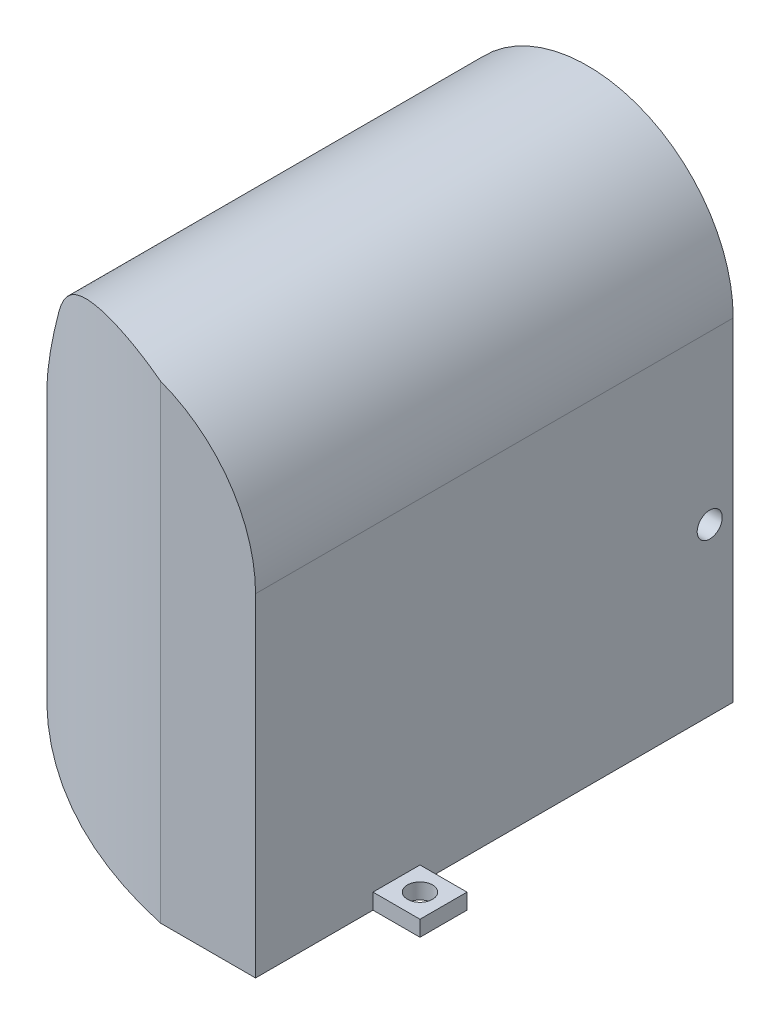
ISO-10303-21;
HEADER;
FILE_DESCRIPTION(('STEP AP214'),'2;1');
FILE_NAME('part.step','',(''),(''),'','','');
FILE_SCHEMA(('AUTOMOTIVE_DESIGN { 1 0 10303 214 1 1 1 1 }'));
ENDSEC;
DATA;
#1=APPLICATION_CONTEXT('core data for automotive mechanical design processes');
#2=APPLICATION_PROTOCOL_DEFINITION('international standard','automotive_design',2000,#1);
#3=PRODUCT_CONTEXT('',#1,'mechanical');
#4=PRODUCT('Part','Part','',(#3));
#5=PRODUCT_RELATED_PRODUCT_CATEGORY('part','',(#4));
#6=PRODUCT_DEFINITION_FORMATION('','',#4);
#7=PRODUCT_DEFINITION_CONTEXT('part definition',#1,'design');
#8=PRODUCT_DEFINITION('design','',#6,#7);
#9=PRODUCT_DEFINITION_SHAPE('','',#8);
#10=(LENGTH_UNIT() NAMED_UNIT(*) SI_UNIT(.MILLI.,.METRE.));
#11=(NAMED_UNIT(*) PLANE_ANGLE_UNIT() SI_UNIT($,.RADIAN.));
#12=(NAMED_UNIT(*) SI_UNIT($,.STERADIAN.) SOLID_ANGLE_UNIT());
#13=UNCERTAINTY_MEASURE_WITH_UNIT(LENGTH_MEASURE(1.E-05),#10,'distance_accuracy_value','');
#14=(GEOMETRIC_REPRESENTATION_CONTEXT(3) GLOBAL_UNCERTAINTY_ASSIGNED_CONTEXT((#13)) GLOBAL_UNIT_ASSIGNED_CONTEXT((#10,
#11,#12)) REPRESENTATION_CONTEXT('',''));
#15=CARTESIAN_POINT('',(0.,0.,0.));
#16=DIRECTION('',(0.,0.,1.));
#17=DIRECTION('',(1.,0.,0.));
#18=AXIS2_PLACEMENT_3D('',#15,#16,#17);
#19=CARTESIAN_POINT('',(41.,0.,60.));
#20=DIRECTION('',(-1.,0.,0.));
#21=DIRECTION('',(0.,0.,1.));
#22=AXIS2_PLACEMENT_3D('',#19,#20,#21);
#23=PLANE('',#22);
#24=DIRECTION('',(0.,0.,-1.));
#25=VECTOR('',#24,1.);
#26=CARTESIAN_POINT('',(41.,0.,60.));
#27=LINE('',#26,#25);
#28=CARTESIAN_POINT('',(41.,0.,61.));
#29=VERTEX_POINT('',#28);
#30=CARTESIAN_POINT('',(41.,0.,46.));
#31=VERTEX_POINT('',#30);
#32=EDGE_CURVE('E453',#29,#31,#27,.T.);
#33=ORIENTED_EDGE('',*,*,#32,.T.);
#34=DIRECTION('',(0.,1.,0.));
#35=VECTOR('',#34,1.);
#36=CARTESIAN_POINT('',(41.,0.,46.));
#37=LINE('',#36,#35);
#38=CARTESIAN_POINT('',(41.,2.00000000000001,46.));
#39=VERTEX_POINT('',#38);
#40=EDGE_CURVE('E64',#31,#39,#37,.T.);
#41=ORIENTED_EDGE('',*,*,#40,.T.);
#42=DIRECTION('',(0.,0.,-1.));
#43=VECTOR('',#42,1.);
#44=CARTESIAN_POINT('',(41.,2.00000000000001,60.));
#45=LINE('',#44,#43);
#46=CARTESIAN_POINT('',(41.,2.00000000000001,40.));
#47=VERTEX_POINT('',#46);
#48=EDGE_CURVE('E59',#39,#47,#45,.T.);
#49=ORIENTED_EDGE('',*,*,#48,.T.);
#50=DIRECTION('',(0.,-1.,0.));
#51=VECTOR('',#50,1.);
#52=CARTESIAN_POINT('',(41.,0.,40.));
#53=LINE('',#52,#51);
#54=CARTESIAN_POINT('',(41.,0.,40.));
#55=VERTEX_POINT('',#54);
#56=EDGE_CURVE('E221',#47,#55,#53,.T.);
#57=ORIENTED_EDGE('',*,*,#56,.T.);
#58=CARTESIAN_POINT('',(41.,0.,0.));
#59=VERTEX_POINT('',#58);
#60=EDGE_CURVE('E461',#55,#59,#27,.T.);
#61=ORIENTED_EDGE('',*,*,#60,.T.);
#62=DIRECTION('',(0.,1.,0.));
#63=VECTOR('',#62,1.);
#64=CARTESIAN_POINT('',(41.,0.,0.));
#65=LINE('',#64,#63);
#66=CARTESIAN_POINT('',(41.,42.5,0.));
#67=VERTEX_POINT('',#66);
#68=EDGE_CURVE('E446',#59,#67,#65,.T.);
#69=ORIENTED_EDGE('',*,*,#68,.T.);
#70=DIRECTION('',(0.,0.,-1.));
#71=VECTOR('',#70,1.);
#72=CARTESIAN_POINT('',(41.,42.5,60.));
#73=LINE('',#72,#71);
#74=CARTESIAN_POINT('',(41.,42.5,61.));
#75=VERTEX_POINT('',#74);
#76=EDGE_CURVE('E468',#75,#67,#73,.T.);
#77=ORIENTED_EDGE('',*,*,#76,.F.);
#78=DIRECTION('',(0.,1.,0.));
#79=VECTOR('',#78,1.);
#80=CARTESIAN_POINT('',(41.,0.,61.));
#81=LINE('',#80,#79);
#82=EDGE_CURVE('E472',#29,#75,#81,.T.);
#83=ORIENTED_EDGE('',*,*,#82,.F.);
#84=EDGE_LOOP('',(#33,#41,#49,#57,#61,#69,#77,#83));
#85=FACE_BOUND('',#84,.T.);
#86=CARTESIAN_POINT('',(41.,21.1481907925071,3.));
#87=DIRECTION('',(-1.,0.,0.));
#88=DIRECTION('',(0.,0.,1.));
#89=AXIS2_PLACEMENT_3D('',#86,#87,#88);
#90=CIRCLE('',#89,1.6);
#91=CARTESIAN_POINT('',(41.,21.1481907925071,4.6));
#92=VERTEX_POINT('',#91);
#93=EDGE_CURVE('E258',#92,#92,#90,.T.);
#94=ORIENTED_EDGE('',*,*,#93,.T.);
#95=EDGE_LOOP('',(#94));
#96=FACE_BOUND('',#95,.T.);
#97=ADVANCED_FACE('F43',(#85,#96),#23,.F.);
#98=CARTESIAN_POINT('',(22.4,42.5,60.));
#99=DIRECTION('',(0.,0.,-1.));
#100=DIRECTION('',(-1.,0.,0.));
#101=AXIS2_PLACEMENT_3D('',#98,#99,#100);
#102=CYLINDRICAL_SURFACE('',#101,18.6);
#103=DIRECTION('',(0.,0.,1.));
#104=VECTOR('',#103,1.);
#105=CARTESIAN_POINT('',(5.95963161562967,51.1990969293483,60.));
#106=LINE('',#105,#104);
#107=CARTESIAN_POINT('',(5.95963161562967,51.1990969293483,51.0792206622552));
#108=VERTEX_POINT('',#107);
#109=CARTESIAN_POINT('',(5.95963161562967,51.1990969293483,0.));
#110=VERTEX_POINT('',#109);
#111=EDGE_CURVE('E452',#108,#110,#106,.F.);
#112=ORIENTED_EDGE('',*,*,#111,.F.);
#113=CARTESIAN_POINT('',(5.95963161562967,51.1990969293483,51.0792206622552));
#114=CARTESIAN_POINT('',(6.22181353208901,51.6945736764828,51.2593201252422));
#115=CARTESIAN_POINT('',(6.50454638650126,52.1747527024764,51.4506623513701));
#116=CARTESIAN_POINT('',(7.10767465086969,53.102388209684,51.8510981432475));
#117=CARTESIAN_POINT('',(7.42803835598747,53.5498717292127,52.0601767250356));
#118=CARTESIAN_POINT('',(8.10265309408327,54.409822920193,52.4911659809748));
#119=CARTESIAN_POINT('',(8.45682359672568,54.8223695943685,52.713045686201));
#120=CARTESIAN_POINT('',(9.19704802370154,55.612404122338,53.1661165525255));
#121=CARTESIAN_POINT('',(9.58310930009141,55.9898838489908,53.3973098544389));
#122=CARTESIAN_POINT('',(10.3832507519513,56.7072338719968,53.864528237691));
#123=CARTESIAN_POINT('',(10.7972342641252,57.0472241649493,54.1005348571444));
#124=CARTESIAN_POINT('',(11.6520905358339,57.6897447139373,54.5748359573429));
#125=CARTESIAN_POINT('',(12.0929638225008,57.9922742352603,54.8131304828615));
#126=CARTESIAN_POINT('',(12.9998704425782,58.5587577445324,55.2892484738611));
#127=CARTESIAN_POINT('',(13.4659302496784,58.8226700176514,55.5270711601659));
#128=CARTESIAN_POINT('',(14.4205193451211,59.3099696703105,55.9992085697476));
#129=CARTESIAN_POINT('',(14.9090499801367,59.5333546170777,56.2335230816617));
#130=CARTESIAN_POINT('',(15.9394074829438,59.951362917407,56.7114800568628));
#131=CARTESIAN_POINT('',(16.4826157593686,60.1430739045921,56.9547021977016));
#132=CARTESIAN_POINT('',(17.5885066876812,60.4761791259661,57.4312810605531));
#133=CARTESIAN_POINT('',(18.151190274113,60.6175709418517,57.6646373079433));
#134=CARTESIAN_POINT('',(19.291389178702,60.8475955007484,58.1184808603315));
#135=CARTESIAN_POINT('',(19.868882026865,60.9363037502546,58.3389861723232));
#136=CARTESIAN_POINT('',(21.0350764992719,61.0591130043127,58.7651040262385));
#137=CARTESIAN_POINT('',(21.6237773083995,61.0932179647384,58.9707176459982));
#138=CARTESIAN_POINT('',(22.7711813970593,61.1045945189213,59.3529719951072));
#139=CARTESIAN_POINT('',(23.3295170676076,61.0852147154793,59.5306156171097));
#140=CARTESIAN_POINT('',(24.4469588294768,60.9955160116376,59.8696512165966));
#141=CARTESIAN_POINT('',(25.0060647923091,60.9252047722397,60.031045634095));
#142=CARTESIAN_POINT('',(26.123082100278,60.7324261704588,60.3374880151854));
#143=CARTESIAN_POINT('',(26.6809722875649,60.6096907647318,60.4824470571938));
#144=CARTESIAN_POINT('',(27.5105534143728,60.3864319736904,60.6865157870998));
#145=CARTESIAN_POINT('',(27.7859885503491,60.3054430808235,60.7523358679176));
#146=CARTESIAN_POINT('',(28.3337565361517,60.1304620321532,60.8795124603225));
#147=CARTESIAN_POINT('',(28.6060892295192,60.0364692236659,60.9408687476298));
#148=CARTESIAN_POINT('',(28.8765566230851,59.9360033926348,61.));
#149=B_SPLINE_CURVE_WITH_KNOTS('',3,(#113,#114,#115,#116,#117,#118,#119,#120,#121,#122,#123,
#124,#125,#126,#127,#128,#129,#130,#131,#132,#133,#134,#135,#136,#137,#138,#139,#140,#141,#142,
#143,#144,#145,#146,#147,#148),.UNSPECIFIED.,.F.,.F.,(4,2,2,2,2,2,2,2,2,2,2,2,2,2,2,2,2,4),(0.,
1.76529700066936,3.52911722516215,5.28883604251708,7.04896168139588,8.80327909443648,
10.5576309091981,12.3138640240531,14.0702025271538,15.9436933987041,17.8172742967289,
19.6881634431577,21.5589170421376,23.3152466385289,25.0713121062801,26.836465840644,
27.7198042976513,28.6031871066947),.UNSPECIFIED.);
#150=CARTESIAN_POINT('',(28.8765566230851,59.9360033926348,61.));
#151=VERTEX_POINT('',#150);
#152=EDGE_CURVE('E465',#108,#151,#149,.T.);
#153=ORIENTED_EDGE('',*,*,#152,.T.);
#154=CARTESIAN_POINT('',(22.4,42.5,61.));
#155=DIRECTION('',(0.,0.,1.));
#156=DIRECTION('',(1.,0.,0.));
#157=AXIS2_PLACEMENT_3D('',#154,#155,#156);
#158=CIRCLE('',#157,18.6);
#159=EDGE_CURVE('E462',#75,#151,#158,.T.);
#160=ORIENTED_EDGE('',*,*,#159,.F.);
#161=ORIENTED_EDGE('',*,*,#76,.T.);
#162=CARTESIAN_POINT('',(22.4,42.5,0.));
#163=DIRECTION('',(0.,0.,1.));
#164=DIRECTION('',(1.,0.,0.));
#165=AXIS2_PLACEMENT_3D('',#162,#163,#164);
#166=CIRCLE('',#165,18.6);
#167=EDGE_CURVE('E442',#67,#110,#166,.T.);
#168=ORIENTED_EDGE('',*,*,#167,.T.);
#169=EDGE_LOOP('',(#112,#153,#160,#161,#168));
#170=FACE_BOUND('',#169,.T.);
#171=ADVANCED_FACE('F337',(#170),#102,.T.);
#172=CARTESIAN_POINT('',(-16.5091487577331,8.73549070841278,60.));
#173=DIRECTION('',(-0.883890773353243,0.467693383298294,0.));
#174=DIRECTION('',(-0.467693383298294,-0.883890773353244,0.));
#175=AXIS2_PLACEMENT_3D('',#172,#173,#174);
#176=PLANE('',#175);
#177=CARTESIAN_POINT('',(-7.47471471767172,25.8096105819147,3.));
#178=DIRECTION('',(-0.883890773353243,0.467693383298294,0.));
#179=DIRECTION('',(-0.467693383298294,-0.883890773353244,0.));
#180=AXIS2_PLACEMENT_3D('',#177,#178,#179);
#181=CIRCLE('',#180,1.6);
#182=CARTESIAN_POINT('',(-8.22302413094899,24.3953853445495,3.));
#183=VERTEX_POINT('',#182);
#184=EDGE_CURVE('E254',#183,#183,#181,.T.);
#185=ORIENTED_EDGE('',*,*,#184,.F.);
#186=EDGE_LOOP('',(#185));
#187=FACE_BOUND('',#186,.T.);
#188=ORIENTED_EDGE('',*,*,#111,.T.);
#189=DIRECTION('',(0.467693383298294,0.883890773353244,0.));
#190=VECTOR('',#189,1.);
#191=CARTESIAN_POINT('',(-16.5091487577331,8.73549070841278,0.));
#192=LINE('',#191,#190);
#193=CARTESIAN_POINT('',(-21.1313615099819,0.,0.));
#194=VERTEX_POINT('',#193);
#195=EDGE_CURVE('E445',#194,#110,#192,.T.);
#196=ORIENTED_EDGE('',*,*,#195,.F.);
#197=DIRECTION('',(0.,0.,-1.));
#198=VECTOR('',#197,1.);
#199=CARTESIAN_POINT('',(-21.1313615099819,0.,60.));
#200=LINE('',#199,#198);
#201=CARTESIAN_POINT('',(-21.1313615099819,0.,9.45382467667989));
#202=VERTEX_POINT('',#201);
#203=EDGE_CURVE('E449',#202,#194,#200,.T.);
#204=ORIENTED_EDGE('',*,*,#203,.F.);
#205=CARTESIAN_POINT('',(42.76,120.747880881674,-2.5));
#206=DIRECTION('',(-0.883890773353243,0.467693383298294,0.));
#207=DIRECTION('',(-0.467693383298294,-0.883890773353244,0.));
#208=AXIS2_PLACEMENT_3D('',#205,#206,#207);
#209=ELLIPSE('',#208,138.979943529676,65.);
#210=EDGE_CURVE('E456',#108,#202,#209,.F.);
#211=ORIENTED_EDGE('',*,*,#210,.F.);
#212=EDGE_LOOP('',(#188,#196,#204,#211));
#213=FACE_BOUND('',#212,.T.);
#214=ADVANCED_FACE('F344',(#187,#213),#176,.T.);
#215=CARTESIAN_POINT('',(0.,0.,60.));
#216=DIRECTION('',(0.,-1.,0.));
#217=DIRECTION('',(1.,0.,0.));
#218=AXIS2_PLACEMENT_3D('',#215,#216,#217);
#219=PLANE('',#218);
#220=ORIENTED_EDGE('',*,*,#60,.F.);
#221=DIRECTION('',(1.,0.,0.));
#222=VECTOR('',#221,1.);
#223=CARTESIAN_POINT('',(40.,0.,40.));
#224=LINE('',#223,#222);
#225=CARTESIAN_POINT('',(47.,0.,40.));
#226=VERTEX_POINT('',#225);
#227=EDGE_CURVE('E243',#55,#226,#224,.T.);
#228=ORIENTED_EDGE('',*,*,#227,.T.);
#229=DIRECTION('',(0.,0.,1.));
#230=VECTOR('',#229,1.);
#231=CARTESIAN_POINT('',(47.,0.,46.));
#232=LINE('',#231,#230);
#233=CARTESIAN_POINT('',(47.,0.,46.));
#234=VERTEX_POINT('',#233);
#235=EDGE_CURVE('E231',#226,#234,#232,.T.);
#236=ORIENTED_EDGE('',*,*,#235,.T.);
#237=DIRECTION('',(-1.,0.,0.));
#238=VECTOR('',#237,1.);
#239=CARTESIAN_POINT('',(40.,0.,46.));
#240=LINE('',#239,#238);
#241=EDGE_CURVE('E240',#234,#31,#240,.T.);
#242=ORIENTED_EDGE('',*,*,#241,.T.);
#243=ORIENTED_EDGE('',*,*,#32,.F.);
#244=DIRECTION('',(-1.,0.,0.));
#245=VECTOR('',#244,1.);
#246=CARTESIAN_POINT('',(0.,0.,61.));
#247=LINE('',#246,#245);
#248=CARTESIAN_POINT('',(28.8765566230851,0.,61.));
#249=VERTEX_POINT('',#248);
#250=EDGE_CURVE('E458',#29,#249,#247,.T.);
#251=ORIENTED_EDGE('',*,*,#250,.T.);
#252=CARTESIAN_POINT('',(42.76,0.,-2.5));
#253=DIRECTION('',(0.,-1.,0.));
#254=DIRECTION('',(1.,0.,0.));
#255=AXIS2_PLACEMENT_3D('',#252,#253,#254);
#256=CIRCLE('',#255,65.);
#257=EDGE_CURVE('E454',#202,#249,#256,.F.);
#258=ORIENTED_EDGE('',*,*,#257,.F.);
#259=ORIENTED_EDGE('',*,*,#203,.T.);
#260=DIRECTION('',(-1.,0.,0.));
#261=VECTOR('',#260,1.);
#262=CARTESIAN_POINT('',(0.,0.,0.));
#263=LINE('',#262,#261);
#264=CARTESIAN_POINT('',(-20.,0.,0.));
#265=VERTEX_POINT('',#264);
#266=EDGE_CURVE('E448',#265,#194,#263,.T.);
#267=ORIENTED_EDGE('',*,*,#266,.F.);
#268=DIRECTION('',(0.,0.,-1.));
#269=VECTOR('',#268,1.);
#270=CARTESIAN_POINT('',(-20.,0.,60.));
#271=LINE('',#270,#269);
#272=CARTESIAN_POINT('',(-20.,0.,10.0372405257298));
#273=VERTEX_POINT('',#272);
#274=EDGE_CURVE('E611',#273,#265,#271,.T.);
#275=ORIENTED_EDGE('',*,*,#274,.F.);
#276=CARTESIAN_POINT('',(42.76,0.,-2.5));
#277=DIRECTION('',(0.,1.,0.));
#278=DIRECTION('',(1.,0.,0.));
#279=AXIS2_PLACEMENT_3D('',#276,#277,#278);
#280=CIRCLE('',#279,64.);
#281=CARTESIAN_POINT('',(28.9850226860441,0.,60.));
#282=VERTEX_POINT('',#281);
#283=EDGE_CURVE('E289',#273,#282,#280,.T.);
#284=ORIENTED_EDGE('',*,*,#283,.T.);
#285=DIRECTION('',(-1.,0.,0.));
#286=VECTOR('',#285,1.);
#287=CARTESIAN_POINT('',(0.,0.,60.));
#288=LINE('',#287,#286);
#289=CARTESIAN_POINT('',(40.,0.,60.));
#290=VERTEX_POINT('',#289);
#291=EDGE_CURVE('E616',#290,#282,#288,.T.);
#292=ORIENTED_EDGE('',*,*,#291,.F.);
#293=DIRECTION('',(0.,0.,-1.));
#294=VECTOR('',#293,1.);
#295=CARTESIAN_POINT('',(40.,0.,60.));
#296=LINE('',#295,#294);
#297=CARTESIAN_POINT('',(40.,0.,0.));
#298=VERTEX_POINT('',#297);
#299=EDGE_CURVE('E498',#290,#298,#296,.T.);
#300=ORIENTED_EDGE('',*,*,#299,.T.);
#301=EDGE_CURVE('E504',#59,#298,#263,.T.);
#302=ORIENTED_EDGE('',*,*,#301,.F.);
#303=EDGE_LOOP('',(#220,#228,#236,#242,#243,#251,#258,#259,#267,#275,#284,#292,#300,#302));
#304=FACE_BOUND('',#303,.T.);
#305=CARTESIAN_POINT('',(44.,0.,43.));
#306=DIRECTION('',(0.,-1.,0.));
#307=DIRECTION('',(1.,0.,0.));
#308=AXIS2_PLACEMENT_3D('',#305,#306,#307);
#309=CIRCLE('',#308,1.6);
#310=CARTESIAN_POINT('',(45.6,0.,43.));
#311=VERTEX_POINT('',#310);
#312=EDGE_CURVE('E532',#311,#311,#309,.T.);
#313=ORIENTED_EDGE('',*,*,#312,.F.);
#314=EDGE_LOOP('',(#313));
#315=FACE_BOUND('',#314,.T.);
#316=ADVANCED_FACE('F354',(#304,#315),#219,.T.);
#317=CARTESIAN_POINT('',(0.,0.,61.));
#318=DIRECTION('',(0.,0.,1.));
#319=DIRECTION('',(1.,0.,0.));
#320=AXIS2_PLACEMENT_3D('',#317,#318,#319);
#321=PLANE('',#320);
#322=DIRECTION('',(0.,-1.,0.));
#323=VECTOR('',#322,1.);
#324=CARTESIAN_POINT('',(28.8765566230851,0.,61.));
#325=LINE('',#324,#323);
#326=EDGE_CURVE('E441',#249,#151,#325,.F.);
#327=ORIENTED_EDGE('',*,*,#326,.F.);
#328=ORIENTED_EDGE('',*,*,#250,.F.);
#329=ORIENTED_EDGE('',*,*,#82,.T.);
#330=ORIENTED_EDGE('',*,*,#159,.T.);
#331=EDGE_LOOP('',(#327,#328,#329,#330));
#332=FACE_BOUND('',#331,.T.);
#333=ADVANCED_FACE('F356',(#332),#321,.T.);
#334=CARTESIAN_POINT('',(0.,0.,0.));
#335=DIRECTION('',(0.,0.,1.));
#336=DIRECTION('',(1.,0.,0.));
#337=AXIS2_PLACEMENT_3D('',#334,#335,#336);
#338=PLANE('',#337);
#339=DIRECTION('',(-0.467693383298294,-0.883890773353244,0.));
#340=VECTOR('',#339,1.);
#341=CARTESIAN_POINT('',(-3.41996224771711,27.0582027520796,0.));
#342=LINE('',#341,#340);
#343=CARTESIAN_POINT('',(-3.51350092437677,26.8814245974089,0.));
#344=VERTEX_POINT('',#343);
#345=CARTESIAN_POINT('',(-6.03904519418756,22.1084144213014,0.));
#346=VERTEX_POINT('',#345);
#347=EDGE_CURVE('E266',#344,#346,#342,.T.);
#348=ORIENTED_EDGE('',*,*,#347,.T.);
#349=DIRECTION('',(0.955714322512609,0.29429599681998,0.));
#350=VECTOR('',#349,1.);
#351=CARTESIAN_POINT('',(-6.03904519418756,22.1084144213014,0.));
#352=LINE('',#351,#350);
#353=CARTESIAN_POINT('',(-6.30936202551787,22.0251749432904,0.));
#354=VERTEX_POINT('',#353);
#355=EDGE_CURVE('E411',#346,#354,#352,.F.);
#356=ORIENTED_EDGE('',*,*,#355,.T.);
#357=DIRECTION('',(-0.883890773353244,0.467693383298294,0.));
#358=VECTOR('',#357,1.);
#359=CARTESIAN_POINT('',(-8.78425619090694,23.3347164165256,0.));
#360=LINE('',#359,#358);
#361=CARTESIAN_POINT('',(-7.90036541755369,22.8670230332273,0.));
#362=VERTEX_POINT('',#361);
#363=EDGE_CURVE('E264',#354,#362,#360,.T.);
#364=ORIENTED_EDGE('',*,*,#363,.T.);
#365=DIRECTION('',(0.467693383298294,0.883890773353244,0.));
#366=VECTOR('',#365,1.);
#367=CARTESIAN_POINT('',(-15.6252579843799,8.26779732511448,0.));
#368=LINE('',#367,#366);
#369=EDGE_CURVE('E522',#265,#362,#368,.T.);
#370=ORIENTED_EDGE('',*,*,#369,.F.);
#371=ORIENTED_EDGE('',*,*,#266,.T.);
#372=ORIENTED_EDGE('',*,*,#195,.T.);
#373=ORIENTED_EDGE('',*,*,#167,.F.);
#374=ORIENTED_EDGE('',*,*,#68,.F.);
#375=ORIENTED_EDGE('',*,*,#301,.T.);
#376=DIRECTION('',(0.,1.,0.));
#377=VECTOR('',#376,1.);
#378=CARTESIAN_POINT('',(40.,0.,0.));
#379=LINE('',#378,#377);
#380=CARTESIAN_POINT('',(40.,18.35,0.));
#381=VERTEX_POINT('',#380);
#382=EDGE_CURVE('E495',#298,#381,#379,.T.);
#383=ORIENTED_EDGE('',*,*,#382,.T.);
#384=DIRECTION('',(-1.,0.,0.));
#385=VECTOR('',#384,1.);
#386=CARTESIAN_POINT('',(41.,18.35,0.));
#387=LINE('',#386,#385);
#388=CARTESIAN_POINT('',(38.2,18.35,0.));
#389=VERTEX_POINT('',#388);
#390=EDGE_CURVE('E273',#381,#389,#387,.T.);
#391=ORIENTED_EDGE('',*,*,#390,.T.);
#392=DIRECTION('',(0.707106781186548,-0.707106781186548,0.));
#393=VECTOR('',#392,1.);
#394=CARTESIAN_POINT('',(38.2,18.35,0.));
#395=LINE('',#394,#393);
#396=CARTESIAN_POINT('',(38.,18.55,0.));
#397=VERTEX_POINT('',#396);
#398=EDGE_CURVE('E415',#389,#397,#395,.F.);
#399=ORIENTED_EDGE('',*,*,#398,.T.);
#400=DIRECTION('',(0.,1.,0.));
#401=VECTOR('',#400,1.);
#402=CARTESIAN_POINT('',(38.,24.15,0.));
#403=LINE('',#402,#401);
#404=CARTESIAN_POINT('',(38.,23.95,0.));
#405=VERTEX_POINT('',#404);
#406=EDGE_CURVE('E292',#397,#405,#403,.T.);
#407=ORIENTED_EDGE('',*,*,#406,.T.);
#408=DIRECTION('',(-0.707106781186548,-0.707106781186548,0.));
#409=VECTOR('',#408,1.);
#410=CARTESIAN_POINT('',(38.,23.95,0.));
#411=LINE('',#410,#409);
#412=CARTESIAN_POINT('',(38.2,24.15,0.));
#413=VERTEX_POINT('',#412);
#414=EDGE_CURVE('E417',#405,#413,#411,.F.);
#415=ORIENTED_EDGE('',*,*,#414,.T.);
#416=DIRECTION('',(1.,0.,0.));
#417=VECTOR('',#416,1.);
#418=CARTESIAN_POINT('',(41.,24.15,0.));
#419=LINE('',#418,#417);
#420=CARTESIAN_POINT('',(40.,24.15,0.));
#421=VERTEX_POINT('',#420);
#422=EDGE_CURVE('E284',#413,#421,#419,.T.);
#423=ORIENTED_EDGE('',*,*,#422,.T.);
#424=CARTESIAN_POINT('',(40.,42.5,0.));
#425=VERTEX_POINT('',#424);
#426=EDGE_CURVE('E308',#421,#425,#379,.T.);
#427=ORIENTED_EDGE('',*,*,#426,.T.);
#428=CARTESIAN_POINT('',(22.4,42.5,0.));
#429=DIRECTION('',(0.,0.,1.));
#430=DIRECTION('',(1.,0.,0.));
#431=AXIS2_PLACEMENT_3D('',#428,#429,#430);
#432=CIRCLE('',#431,17.6);
#433=CARTESIAN_POINT('',(6.8435223889829,50.73140354605,0.));
#434=VERTEX_POINT('',#433);
#435=EDGE_CURVE('E500',#425,#434,#432,.T.);
#436=ORIENTED_EDGE('',*,*,#435,.T.);
#437=CARTESIAN_POINT('',(-5.18774379442359,27.9935895186761,0.));
#438=VERTEX_POINT('',#437);
#439=EDGE_CURVE('E608',#438,#434,#368,.T.);
#440=ORIENTED_EDGE('',*,*,#439,.F.);
#441=DIRECTION('',(0.883890773353244,-0.467693383298294,0.));
#442=VECTOR('',#441,1.);
#443=CARTESIAN_POINT('',(-6.07163456777685,28.4612829019744,0.));
#444=LINE('',#443,#442);
#445=CARTESIAN_POINT('',(-3.59674040238775,27.1517414287392,0.));
#446=VERTEX_POINT('',#445);
#447=EDGE_CURVE('E270',#438,#446,#444,.T.);
#448=ORIENTED_EDGE('',*,*,#447,.T.);
#449=DIRECTION('',(-0.294295996819998,0.955714322512603,0.));
#450=VECTOR('',#449,1.);
#451=CARTESIAN_POINT('',(-3.59674040238775,27.1517414287392,0.));
#452=LINE('',#451,#450);
#453=EDGE_CURVE('E413',#446,#344,#452,.F.);
#454=ORIENTED_EDGE('',*,*,#453,.T.);
#455=EDGE_LOOP('',(#348,#356,#364,#370,#371,#372,#373,#374,#375,#383,#391,#399,#407,#415,#423,
#427,#436,#440,#448,#454));
#456=FACE_BOUND('',#455,.T.);
#457=ADVANCED_FACE('F359',(#456),#338,.F.);
#458=CARTESIAN_POINT('',(42.76,60.1,-2.5));
#459=DIRECTION('',(0.,-1.,0.));
#460=DIRECTION('',(1.,0.,0.));
#461=AXIS2_PLACEMENT_3D('',#458,#459,#460);
#462=CYLINDRICAL_SURFACE('',#461,65.);
#463=ORIENTED_EDGE('',*,*,#152,.F.);
#464=ORIENTED_EDGE('',*,*,#210,.T.);
#465=ORIENTED_EDGE('',*,*,#257,.T.);
#466=ORIENTED_EDGE('',*,*,#326,.T.);
#467=EDGE_LOOP('',(#463,#464,#465,#466));
#468=FACE_BOUND('',#467,.T.);
#469=ADVANCED_FACE('F350',(#468),#462,.T.);
#470=CARTESIAN_POINT('',(40.,0.,60.));
#471=DIRECTION('',(-1.,0.,0.));
#472=DIRECTION('',(0.,0.,1.));
#473=AXIS2_PLACEMENT_3D('',#470,#471,#472);
#474=PLANE('',#473);
#475=ORIENTED_EDGE('',*,*,#382,.F.);
#476=ORIENTED_EDGE('',*,*,#299,.F.);
#477=DIRECTION('',(0.,1.,0.));
#478=VECTOR('',#477,1.);
#479=CARTESIAN_POINT('',(40.,0.,60.));
#480=LINE('',#479,#478);
#481=CARTESIAN_POINT('',(40.,42.5,60.));
#482=VERTEX_POINT('',#481);
#483=EDGE_CURVE('E309',#290,#482,#480,.T.);
#484=ORIENTED_EDGE('',*,*,#483,.T.);
#485=DIRECTION('',(0.,0.,-1.));
#486=VECTOR('',#485,1.);
#487=CARTESIAN_POINT('',(40.,42.5,60.));
#488=LINE('',#487,#486);
#489=EDGE_CURVE('E605',#482,#425,#488,.T.);
#490=ORIENTED_EDGE('',*,*,#489,.T.);
#491=ORIENTED_EDGE('',*,*,#426,.F.);
#492=DIRECTION('',(0.,0.,-1.));
#493=VECTOR('',#492,1.);
#494=CARTESIAN_POINT('',(40.,24.15,60.));
#495=LINE('',#494,#493);
#496=CARTESIAN_POINT('',(40.,24.15,6.));
#497=VERTEX_POINT('',#496);
#498=EDGE_CURVE('E433',#497,#421,#495,.T.);
#499=ORIENTED_EDGE('',*,*,#498,.F.);
#500=DIRECTION('',(0.,-1.,0.));
#501=VECTOR('',#500,1.);
#502=CARTESIAN_POINT('',(40.,0.,6.));
#503=LINE('',#502,#501);
#504=CARTESIAN_POINT('',(40.,18.35,6.));
#505=VERTEX_POINT('',#504);
#506=EDGE_CURVE('E438',#497,#505,#503,.T.);
#507=ORIENTED_EDGE('',*,*,#506,.T.);
#508=DIRECTION('',(0.,0.,1.));
#509=VECTOR('',#508,1.);
#510=CARTESIAN_POINT('',(40.,18.35,60.));
#511=LINE('',#510,#509);
#512=EDGE_CURVE('E436',#381,#505,#511,.T.);
#513=ORIENTED_EDGE('',*,*,#512,.F.);
#514=EDGE_LOOP('',(#475,#476,#484,#490,#491,#499,#507,#513));
#515=FACE_BOUND('',#514,.T.);
#516=ADVANCED_FACE('F334',(#515),#474,.T.);
#517=CARTESIAN_POINT('',(22.4,42.5,60.));
#518=DIRECTION('',(0.,0.,-1.));
#519=DIRECTION('',(-1.,0.,0.));
#520=AXIS2_PLACEMENT_3D('',#517,#518,#519);
#521=CYLINDRICAL_SURFACE('',#520,17.6);
#522=DIRECTION('',(0.,0.,-1.));
#523=VECTOR('',#522,1.);
#524=CARTESIAN_POINT('',(6.8435223889829,50.73140354605,60.));
#525=LINE('',#524,#523);
#526=CARTESIAN_POINT('',(6.8435223889829,50.73140354605,50.4717531899531));
#527=VERTEX_POINT('',#526);
#528=EDGE_CURVE('E607',#527,#434,#525,.T.);
#529=ORIENTED_EDGE('',*,*,#528,.T.);
#530=ORIENTED_EDGE('',*,*,#435,.F.);
#531=ORIENTED_EDGE('',*,*,#489,.F.);
#532=CARTESIAN_POINT('',(22.4,42.5,60.));
#533=DIRECTION('',(0.,0.,1.));
#534=DIRECTION('',(1.,0.,0.));
#535=AXIS2_PLACEMENT_3D('',#532,#533,#534);
#536=CIRCLE('',#535,17.6);
#537=CARTESIAN_POINT('',(28.9850226860441,58.8216872970991,60.));
#538=VERTEX_POINT('',#537);
#539=EDGE_CURVE('E619',#482,#538,#536,.T.);
#540=ORIENTED_EDGE('',*,*,#539,.T.);
#541=CARTESIAN_POINT('',(6.84352238898291,50.73140354605,50.4717531899531));
#542=CARTESIAN_POINT('',(7.09116756837729,51.1994172632575,50.6396833573593));
#543=CARTESIAN_POINT('',(7.35822186288431,51.6530490667649,50.8182042923448));
#544=CARTESIAN_POINT('',(7.92787965896822,52.5294897863249,51.1920732788339));
#545=CARTESIAN_POINT('',(8.23045328757993,52.9523241258616,51.3874071537129));
#546=CARTESIAN_POINT('',(8.86746662692828,53.7648294742131,51.7903121646824));
#547=CARTESIAN_POINT('',(9.20182053328629,54.1545846888381,51.9978498038455));
#548=CARTESIAN_POINT('',(9.90054024015959,54.9010038135808,52.4219710677086));
#549=CARTESIAN_POINT('',(10.2649128991931,55.257660121642,52.6385567540537));
#550=CARTESIAN_POINT('',(11.0200412140615,55.9355187508182,53.0766584683485));
#551=CARTESIAN_POINT('',(11.4107104946231,56.256828811563,53.29815689272));
#552=CARTESIAN_POINT('',(12.2172308121653,56.8640518768782,53.7436793592763));
#553=CARTESIAN_POINT('',(12.6330798721826,57.14996765504,53.9677032020594));
#554=CARTESIAN_POINT('',(13.4883261705009,57.6854161708113,54.415748130626));
#555=CARTESIAN_POINT('',(13.9277481499621,57.9349096173992,54.6397689565336));
#556=CARTESIAN_POINT('',(14.827573026176,58.3957188704129,55.0849940113059));
#557=CARTESIAN_POINT('',(15.287977062022,58.6070326010038,55.3061980864162));
#558=CARTESIAN_POINT('',(16.2596674465457,59.0030314083685,55.7583791345264));
#559=CARTESIAN_POINT('',(16.7722786184271,59.1848995902234,55.9889871276255));
#560=CARTESIAN_POINT('',(17.815687123468,59.5012155957263,56.4415365293215));
#561=CARTESIAN_POINT('',(18.3464858994874,59.6356596475201,56.6634772473232));
#562=CARTESIAN_POINT('',(19.4226217930121,59.8550137802223,57.0961635573531));
#563=CARTESIAN_POINT('',(19.9679541095471,59.9399400117259,57.3069127791619));
#564=CARTESIAN_POINT('',(20.7935823343216,60.0287219423858,57.61291743465));
#565=CARTESIAN_POINT('',(21.0700541887896,60.0518812234951,57.7132293376069));
#566=CARTESIAN_POINT('',(21.6251320010349,60.0851328617475,57.9102978953422));
#567=CARTESIAN_POINT('',(21.9037384989274,60.0952217940415,58.0070536118356));
#568=CARTESIAN_POINT('',(22.6623483870563,60.1045675923545,58.2646304723838));
#569=CARTESIAN_POINT('',(23.1438341227768,60.0909108174922,58.4217620915572));
#570=CARTESIAN_POINT('',(24.1077682015583,60.0236110508773,58.7237647988072));
#571=CARTESIAN_POINT('',(24.5902164140528,59.9699731578439,58.8686374476251));
#572=CARTESIAN_POINT('',(25.5516316988429,59.8223343211828,59.1451275141684));
#573=CARTESIAN_POINT('',(26.0306039189898,59.7284174092232,59.2767718275075));
#574=CARTESIAN_POINT('',(26.9821468131118,59.5000900902117,59.5266156272424));
#575=CARTESIAN_POINT('',(27.4547211575139,59.3657040265122,59.6448231375419));
#576=CARTESIAN_POINT('',(28.1009871346406,59.15215555579,59.7988543666412));
#577=CARTESIAN_POINT('',(28.2790941837048,59.0901149919829,59.8404881815365));
#578=CARTESIAN_POINT('',(28.6334511430779,58.9602442463436,59.9217398252509));
#579=CARTESIAN_POINT('',(28.8097026390335,58.8924195511432,59.9613595088878));
#580=CARTESIAN_POINT('',(28.9850226860441,58.8216872970991,60.));
#581=B_SPLINE_CURVE_WITH_KNOTS('',3,(#541,#542,#543,#544,#545,#546,#547,#548,#549,#550,#551,
#552,#553,#554,#555,#556,#557,#558,#559,#560,#561,#562,#563,#564,#565,#566,#567,#568,#569,#570,
#571,#572,#573,#574,#575,#576,#577,#578,#579,#580),.UNSPECIFIED.,.F.,.F.,(4,2,2,2,2,2,2,2,2,2,2,
2,2,2,2,2,2,2,2,4),(0.,1.66545864114637,3.3295264771756,4.98922260400049,6.64929898624535,
8.30416619728715,9.95890364626907,11.6154131771817,13.2720127455959,15.0421279886753,
16.8123839852477,18.5820622765793,19.466843474689,20.3518564668913,21.8700390585528,
23.3880280722702,24.9028654861735,26.4167934960441,26.9961416256981,27.5749461910351),.UNSPECIFIED.);
#582=EDGE_CURVE('E300',#527,#538,#581,.T.);
#583=ORIENTED_EDGE('',*,*,#582,.F.);
#584=EDGE_LOOP('',(#529,#530,#531,#540,#583));
#585=FACE_BOUND('',#584,.T.);
#586=ADVANCED_FACE('F311',(#585),#521,.F.);
#587=CARTESIAN_POINT('',(-15.6252579843799,8.26779732511448,60.));
#588=DIRECTION('',(-0.883890773353243,0.467693383298294,0.));
#589=DIRECTION('',(-0.467693383298294,-0.883890773353244,0.));
#590=AXIS2_PLACEMENT_3D('',#587,#588,#589);
#591=PLANE('',#590);
#592=DIRECTION('',(-0.467693383298294,-0.883890773353244,0.));
#593=VECTOR('',#592,1.);
#594=CARTESIAN_POINT('',(-15.6252579843799,8.26779732511448,6.));
#595=LINE('',#594,#593);
#596=CARTESIAN_POINT('',(-5.18774379442359,27.9935895186761,6.));
#597=VERTEX_POINT('',#596);
#598=CARTESIAN_POINT('',(-7.9003654175537,22.8670230332273,6.));
#599=VERTEX_POINT('',#598);
#600=EDGE_CURVE('E430',#597,#599,#595,.T.);
#601=ORIENTED_EDGE('',*,*,#600,.F.);
#602=DIRECTION('',(0.,0.,-1.));
#603=VECTOR('',#602,1.);
#604=CARTESIAN_POINT('',(-5.18774379442359,27.9935895186761,60.));
#605=LINE('',#604,#603);
#606=EDGE_CURVE('E424',#597,#438,#605,.T.);
#607=ORIENTED_EDGE('',*,*,#606,.T.);
#608=ORIENTED_EDGE('',*,*,#439,.T.);
#609=ORIENTED_EDGE('',*,*,#528,.F.);
#610=CARTESIAN_POINT('',(42.76,118.609727904294,-2.5));
#611=DIRECTION('',(-0.883890773353243,0.467693383298294,0.));
#612=DIRECTION('',(-0.467693383298294,-0.883890773353244,0.));
#613=AXIS2_PLACEMENT_3D('',#610,#611,#612);
#614=ELLIPSE('',#613,136.841790552296,64.);
#615=EDGE_CURVE('E298',#527,#273,#614,.F.);
#616=ORIENTED_EDGE('',*,*,#615,.T.);
#617=ORIENTED_EDGE('',*,*,#274,.T.);
#618=ORIENTED_EDGE('',*,*,#369,.T.);
#619=DIRECTION('',(0.,0.,1.));
#620=VECTOR('',#619,1.);
#621=CARTESIAN_POINT('',(-7.9003654175537,22.8670230332273,60.));
#622=LINE('',#621,#620);
#623=EDGE_CURVE('E427',#362,#599,#622,.T.);
#624=ORIENTED_EDGE('',*,*,#623,.T.);
#625=EDGE_LOOP('',(#601,#607,#608,#609,#616,#617,#618,#624));
#626=FACE_BOUND('',#625,.T.);
#627=ADVANCED_FACE('F326',(#626),#591,.F.);
#628=CARTESIAN_POINT('',(0.,0.,60.));
#629=DIRECTION('',(0.,0.,1.));
#630=DIRECTION('',(1.,0.,0.));
#631=AXIS2_PLACEMENT_3D('',#628,#629,#630);
#632=PLANE('',#631);
#633=DIRECTION('',(0.,-1.,0.));
#634=VECTOR('',#633,1.);
#635=CARTESIAN_POINT('',(28.9850226860441,60.1,60.));
#636=LINE('',#635,#634);
#637=EDGE_CURVE('E457',#282,#538,#636,.F.);
#638=ORIENTED_EDGE('',*,*,#637,.T.);
#639=ORIENTED_EDGE('',*,*,#539,.F.);
#640=ORIENTED_EDGE('',*,*,#483,.F.);
#641=ORIENTED_EDGE('',*,*,#291,.T.);
#642=EDGE_LOOP('',(#638,#639,#640,#641));
#643=FACE_BOUND('',#642,.T.);
#644=ADVANCED_FACE('F321',(#643),#632,.F.);
#645=CARTESIAN_POINT('',(42.76,60.1,-2.5));
#646=DIRECTION('',(0.,-1.,0.));
#647=DIRECTION('',(1.,0.,0.));
#648=AXIS2_PLACEMENT_3D('',#645,#646,#647);
#649=CYLINDRICAL_SURFACE('',#648,64.);
#650=ORIENTED_EDGE('',*,*,#582,.T.);
#651=ORIENTED_EDGE('',*,*,#637,.F.);
#652=ORIENTED_EDGE('',*,*,#283,.F.);
#653=ORIENTED_EDGE('',*,*,#615,.F.);
#654=EDGE_LOOP('',(#650,#651,#652,#653));
#655=FACE_BOUND('',#654,.T.);
#656=ADVANCED_FACE('F315',(#655),#649,.F.);
#657=CARTESIAN_POINT('',(41.,24.15,6.));
#658=DIRECTION('',(0.,1.,0.));
#659=DIRECTION('',(0.,0.,1.));
#660=AXIS2_PLACEMENT_3D('',#657,#658,#659);
#661=PLANE('',#660);
#662=ORIENTED_EDGE('',*,*,#422,.F.);
#663=DIRECTION('',(0.,0.,1.));
#664=VECTOR('',#663,1.);
#665=CARTESIAN_POINT('',(38.2,24.15,6.));
#666=LINE('',#665,#664);
#667=CARTESIAN_POINT('',(38.2,24.15,6.));
#668=VERTEX_POINT('',#667);
#669=EDGE_CURVE('E11',#413,#668,#666,.T.);
#670=ORIENTED_EDGE('',*,*,#669,.T.);
#671=DIRECTION('',(1.,0.,0.));
#672=VECTOR('',#671,1.);
#673=CARTESIAN_POINT('',(41.,24.15,6.));
#674=LINE('',#673,#672);
#675=EDGE_CURVE('E287',#668,#497,#674,.T.);
#676=ORIENTED_EDGE('',*,*,#675,.T.);
#677=ORIENTED_EDGE('',*,*,#498,.T.);
#678=EDGE_LOOP('',(#662,#670,#676,#677));
#679=FACE_BOUND('',#678,.T.);
#680=ADVANCED_FACE('F320',(#679),#661,.T.);
#681=CARTESIAN_POINT('',(38.,24.15,6.));
#682=DIRECTION('',(-1.,0.,0.));
#683=DIRECTION('',(0.,0.,1.));
#684=AXIS2_PLACEMENT_3D('',#681,#682,#683);
#685=PLANE('',#684);
#686=CARTESIAN_POINT('',(38.,21.1481907925071,3.));
#687=DIRECTION('',(-1.,0.,0.));
#688=DIRECTION('',(0.,0.,1.));
#689=AXIS2_PLACEMENT_3D('',#686,#687,#688);
#690=CIRCLE('',#689,1.6);
#691=CARTESIAN_POINT('',(38.,21.1481907925071,4.6));
#692=VERTEX_POINT('',#691);
#693=EDGE_CURVE('E257',#692,#692,#690,.T.);
#694=ORIENTED_EDGE('',*,*,#693,.F.);
#695=EDGE_LOOP('',(#694));
#696=FACE_BOUND('',#695,.T.);
#697=ORIENTED_EDGE('',*,*,#406,.F.);
#698=DIRECTION('',(0.,0.,1.));
#699=VECTOR('',#698,1.);
#700=CARTESIAN_POINT('',(38.,18.55,6.));
#701=LINE('',#700,#699);
#702=CARTESIAN_POINT('',(38.,18.55,6.));
#703=VERTEX_POINT('',#702);
#704=EDGE_CURVE('E388',#397,#703,#701,.T.);
#705=ORIENTED_EDGE('',*,*,#704,.T.);
#706=DIRECTION('',(0.,1.,0.));
#707=VECTOR('',#706,1.);
#708=CARTESIAN_POINT('',(38.,24.15,6.));
#709=LINE('',#708,#707);
#710=CARTESIAN_POINT('',(38.,23.95,6.));
#711=VERTEX_POINT('',#710);
#712=EDGE_CURVE('E283',#703,#711,#709,.T.);
#713=ORIENTED_EDGE('',*,*,#712,.T.);
#714=DIRECTION('',(0.,0.,-1.));
#715=VECTOR('',#714,1.);
#716=CARTESIAN_POINT('',(38.,23.95,6.));
#717=LINE('',#716,#715);
#718=EDGE_CURVE('E398',#711,#405,#717,.T.);
#719=ORIENTED_EDGE('',*,*,#718,.T.);
#720=EDGE_LOOP('',(#697,#705,#713,#719));
#721=FACE_BOUND('',#720,.T.);
#722=ADVANCED_FACE('F580',(#696,#721),#685,.T.);
#723=CARTESIAN_POINT('',(41.,18.35,6.));
#724=DIRECTION('',(0.,-1.,0.));
#725=DIRECTION('',(0.,0.,-1.));
#726=AXIS2_PLACEMENT_3D('',#723,#724,#725);
#727=PLANE('',#726);
#728=DIRECTION('',(-1.,0.,0.));
#729=VECTOR('',#728,1.);
#730=CARTESIAN_POINT('',(41.,18.35,6.));
#731=LINE('',#730,#729);
#732=CARTESIAN_POINT('',(38.2,18.35,6.));
#733=VERTEX_POINT('',#732);
#734=EDGE_CURVE('E280',#505,#733,#731,.T.);
#735=ORIENTED_EDGE('',*,*,#734,.T.);
#736=DIRECTION('',(0.,0.,-1.));
#737=VECTOR('',#736,1.);
#738=CARTESIAN_POINT('',(38.2,18.35,6.));
#739=LINE('',#738,#737);
#740=EDGE_CURVE('E390',#733,#389,#739,.T.);
#741=ORIENTED_EDGE('',*,*,#740,.T.);
#742=ORIENTED_EDGE('',*,*,#390,.F.);
#743=ORIENTED_EDGE('',*,*,#512,.T.);
#744=EDGE_LOOP('',(#735,#741,#742,#743));
#745=FACE_BOUND('',#744,.T.);
#746=ADVANCED_FACE('F323',(#745),#727,.T.);
#747=CARTESIAN_POINT('',(0.,0.,6.));
#748=DIRECTION('',(0.,0.,-1.));
#749=DIRECTION('',(-1.,0.,0.));
#750=AXIS2_PLACEMENT_3D('',#747,#748,#749);
#751=PLANE('',#750);
#752=ORIENTED_EDGE('',*,*,#712,.F.);
#753=DIRECTION('',(-0.707106781186548,0.707106781186548,0.));
#754=VECTOR('',#753,1.);
#755=CARTESIAN_POINT('',(38.2,18.35,6.));
#756=LINE('',#755,#754);
#757=EDGE_CURVE('E52',#703,#733,#756,.F.);
#758=ORIENTED_EDGE('',*,*,#757,.T.);
#759=ORIENTED_EDGE('',*,*,#734,.F.);
#760=ORIENTED_EDGE('',*,*,#506,.F.);
#761=ORIENTED_EDGE('',*,*,#675,.F.);
#762=DIRECTION('',(0.707106781186548,0.707106781186548,0.));
#763=VECTOR('',#762,1.);
#764=CARTESIAN_POINT('',(38.,23.95,6.));
#765=LINE('',#764,#763);
#766=EDGE_CURVE('E394',#668,#711,#765,.F.);
#767=ORIENTED_EDGE('',*,*,#766,.T.);
#768=EDGE_LOOP('',(#752,#758,#759,#760,#761,#767));
#769=FACE_BOUND('',#768,.T.);
#770=ADVANCED_FACE('F565',(#769),#751,.F.);
#771=CARTESIAN_POINT('',(-6.07163456777685,28.4612829019744,6.));
#772=DIRECTION('',(0.467693383298294,0.883890773353244,0.));
#773=DIRECTION('',(-0.883890773353244,0.467693383298294,0.));
#774=AXIS2_PLACEMENT_3D('',#771,#772,#773);
#775=PLANE('',#774);
#776=DIRECTION('',(0.883890773353244,-0.467693383298294,0.));
#777=VECTOR('',#776,1.);
#778=CARTESIAN_POINT('',(-6.07163456777685,28.4612829019744,6.));
#779=LINE('',#778,#777);
#780=CARTESIAN_POINT('',(-3.59674040238775,27.1517414287392,6.));
#781=VERTEX_POINT('',#780);
#782=EDGE_CURVE('E267',#597,#781,#779,.T.);
#783=ORIENTED_EDGE('',*,*,#782,.T.);
#784=DIRECTION('',(0.,0.,-1.));
#785=VECTOR('',#784,1.);
#786=CARTESIAN_POINT('',(-3.59674040238775,27.1517414287392,6.));
#787=LINE('',#786,#785);
#788=EDGE_CURVE('E402',#781,#446,#787,.T.);
#789=ORIENTED_EDGE('',*,*,#788,.T.);
#790=ORIENTED_EDGE('',*,*,#447,.F.);
#791=ORIENTED_EDGE('',*,*,#606,.F.);
#792=EDGE_LOOP('',(#783,#789,#790,#791));
#793=FACE_BOUND('',#792,.T.);
#794=ADVANCED_FACE('F561',(#793),#775,.T.);
#795=CARTESIAN_POINT('',(-8.78425619090694,23.3347164165256,6.));
#796=DIRECTION('',(-0.467693383298294,-0.883890773353244,0.));
#797=DIRECTION('',(0.883890773353244,-0.467693383298294,0.));
#798=AXIS2_PLACEMENT_3D('',#795,#796,#797);
#799=PLANE('',#798);
#800=ORIENTED_EDGE('',*,*,#363,.F.);
#801=DIRECTION('',(0.,0.,1.));
#802=VECTOR('',#801,1.);
#803=CARTESIAN_POINT('',(-6.30936202551787,22.0251749432904,6.));
#804=LINE('',#803,#802);
#805=CARTESIAN_POINT('',(-6.30936202551787,22.0251749432904,6.));
#806=VERTEX_POINT('',#805);
#807=EDGE_CURVE('E409',#354,#806,#804,.T.);
#808=ORIENTED_EDGE('',*,*,#807,.T.);
#809=DIRECTION('',(-0.883890773353244,0.467693383298294,0.));
#810=VECTOR('',#809,1.);
#811=CARTESIAN_POINT('',(-8.78425619090694,23.3347164165256,6.));
#812=LINE('',#811,#810);
#813=EDGE_CURVE('E261',#806,#599,#812,.T.);
#814=ORIENTED_EDGE('',*,*,#813,.T.);
#815=ORIENTED_EDGE('',*,*,#623,.F.);
#816=EDGE_LOOP('',(#800,#808,#814,#815));
#817=FACE_BOUND('',#816,.T.);
#818=ADVANCED_FACE('F564',(#817),#799,.T.);
#819=CARTESIAN_POINT('',(0.,0.,6.));
#820=DIRECTION('',(0.,0.,-1.));
#821=DIRECTION('',(-1.,0.,0.));
#822=AXIS2_PLACEMENT_3D('',#819,#820,#821);
#823=PLANE('',#822);
#824=ORIENTED_EDGE('',*,*,#813,.F.);
#825=DIRECTION('',(-0.955714322512609,-0.29429599681998,0.));
#826=VECTOR('',#825,1.);
#827=CARTESIAN_POINT('',(-6.03904519418756,22.1084144213014,6.));
#828=LINE('',#827,#826);
#829=CARTESIAN_POINT('',(-6.03904519418756,22.1084144213014,6.));
#830=VERTEX_POINT('',#829);
#831=EDGE_CURVE('E405',#806,#830,#828,.F.);
#832=ORIENTED_EDGE('',*,*,#831,.T.);
#833=DIRECTION('',(-0.467693383298294,-0.883890773353244,0.));
#834=VECTOR('',#833,1.);
#835=CARTESIAN_POINT('',(-3.41996224771711,27.0582027520796,6.));
#836=LINE('',#835,#834);
#837=CARTESIAN_POINT('',(-3.51350092437677,26.8814245974089,6.));
#838=VERTEX_POINT('',#837);
#839=EDGE_CURVE('E275',#838,#830,#836,.T.);
#840=ORIENTED_EDGE('',*,*,#839,.F.);
#841=DIRECTION('',(0.294295996819998,-0.955714322512603,0.));
#842=VECTOR('',#841,1.);
#843=CARTESIAN_POINT('',(-3.59674040238775,27.1517414287392,6.));
#844=LINE('',#843,#842);
#845=EDGE_CURVE('E407',#838,#781,#844,.F.);
#846=ORIENTED_EDGE('',*,*,#845,.T.);
#847=ORIENTED_EDGE('',*,*,#782,.F.);
#848=ORIENTED_EDGE('',*,*,#600,.T.);
#849=EDGE_LOOP('',(#824,#832,#840,#846,#847,#848));
#850=FACE_BOUND('',#849,.T.);
#851=ADVANCED_FACE('F569',(#850),#823,.F.);
#852=CARTESIAN_POINT('',(-3.41996224771711,27.0582027520796,6.));
#853=DIRECTION('',(0.883890773353244,-0.467693383298294,0.));
#854=DIRECTION('',(0.467693383298294,0.883890773353244,0.));
#855=AXIS2_PLACEMENT_3D('',#852,#853,#854);
#856=PLANE('',#855);
#857=CARTESIAN_POINT('',(-4.823042397612,24.4065304320198,3.));
#858=DIRECTION('',(0.883890773353244,-0.467693383298294,0.));
#859=DIRECTION('',(0.467693383298294,0.883890773353244,0.));
#860=AXIS2_PLACEMENT_3D('',#857,#858,#859);
#861=CIRCLE('',#860,1.6);
#862=CARTESIAN_POINT('',(-4.07473298433473,25.820755669385,3.));
#863=VERTEX_POINT('',#862);
#864=EDGE_CURVE('E251',#863,#863,#861,.T.);
#865=ORIENTED_EDGE('',*,*,#864,.F.);
#866=EDGE_LOOP('',(#865));
#867=FACE_BOUND('',#866,.T.);
#868=ORIENTED_EDGE('',*,*,#839,.T.);
#869=DIRECTION('',(0.,0.,-1.));
#870=VECTOR('',#869,1.);
#871=CARTESIAN_POINT('',(-6.03904519418756,22.1084144213014,6.));
#872=LINE('',#871,#870);
#873=EDGE_CURVE('E419',#830,#346,#872,.T.);
#874=ORIENTED_EDGE('',*,*,#873,.T.);
#875=ORIENTED_EDGE('',*,*,#347,.F.);
#876=DIRECTION('',(0.,0.,1.));
#877=VECTOR('',#876,1.);
#878=CARTESIAN_POINT('',(-3.51350092437677,26.8814245974089,6.));
#879=LINE('',#878,#877);
#880=EDGE_CURVE('E422',#344,#838,#879,.T.);
#881=ORIENTED_EDGE('',*,*,#880,.T.);
#882=EDGE_LOOP('',(#868,#874,#875,#881));
#883=FACE_BOUND('',#882,.T.);
#884=ADVANCED_FACE('F559',(#867,#883),#856,.T.);
#885=CARTESIAN_POINT('',(41.,21.1481907925071,3.));
#886=DIRECTION('',(-1.,0.,0.));
#887=DIRECTION('',(0.,0.,1.));
#888=AXIS2_PLACEMENT_3D('',#885,#886,#887);
#889=CYLINDRICAL_SURFACE('',#888,1.6);
#890=ORIENTED_EDGE('',*,*,#93,.F.);
#891=EDGE_LOOP('',(#890));
#892=FACE_BOUND('',#891,.T.);
#893=ORIENTED_EDGE('',*,*,#693,.T.);
#894=EDGE_LOOP('',(#893));
#895=FACE_BOUND('',#894,.T.);
#896=ADVANCED_FACE('F556',(#892,#895),#889,.F.);
#897=CARTESIAN_POINT('',(-32.7328355458965,39.1744474396341,3.));
#898=DIRECTION('',(0.883890773353244,-0.467693383298294,0.));
#899=DIRECTION('',(0.467693383298294,0.883890773353244,0.));
#900=AXIS2_PLACEMENT_3D('',#897,#898,#899);
#901=CYLINDRICAL_SURFACE('',#900,1.6);
#902=ORIENTED_EDGE('',*,*,#184,.T.);
#903=EDGE_LOOP('',(#902));
#904=FACE_BOUND('',#903,.T.);
#905=ORIENTED_EDGE('',*,*,#864,.T.);
#906=EDGE_LOOP('',(#905));
#907=FACE_BOUND('',#906,.T.);
#908=ADVANCED_FACE('F369',(#904,#907),#901,.F.);
#909=CARTESIAN_POINT('',(-6.03904519418756,22.1084144213014,6.));
#910=DIRECTION('',(-0.29429599681998,0.955714322512608,0.));
#911=DIRECTION('',(0.,0.,-1.));
#912=AXIS2_PLACEMENT_3D('',#909,#910,#911);
#913=PLANE('',#912);
#914=ORIENTED_EDGE('',*,*,#831,.F.);
#915=ORIENTED_EDGE('',*,*,#807,.F.);
#916=ORIENTED_EDGE('',*,*,#355,.F.);
#917=ORIENTED_EDGE('',*,*,#873,.F.);
#918=EDGE_LOOP('',(#914,#915,#916,#917));
#919=FACE_BOUND('',#918,.T.);
#920=ADVANCED_FACE('F362',(#919),#913,.F.);
#921=CARTESIAN_POINT('',(-3.59674040238775,27.1517414287392,6.));
#922=DIRECTION('',(-0.955714322512603,-0.294295996819998,0.));
#923=DIRECTION('',(0.,0.,-1.));
#924=AXIS2_PLACEMENT_3D('',#921,#922,#923);
#925=PLANE('',#924);
#926=ORIENTED_EDGE('',*,*,#845,.F.);
#927=ORIENTED_EDGE('',*,*,#880,.F.);
#928=ORIENTED_EDGE('',*,*,#453,.F.);
#929=ORIENTED_EDGE('',*,*,#788,.F.);
#930=EDGE_LOOP('',(#926,#927,#928,#929));
#931=FACE_BOUND('',#930,.T.);
#932=ADVANCED_FACE('F368',(#931),#925,.F.);
#933=CARTESIAN_POINT('',(38.2,18.35,6.));
#934=DIRECTION('',(0.707106781186548,0.707106781186548,0.));
#935=DIRECTION('',(0.,0.,-1.));
#936=AXIS2_PLACEMENT_3D('',#933,#934,#935);
#937=PLANE('',#936);
#938=ORIENTED_EDGE('',*,*,#757,.F.);
#939=ORIENTED_EDGE('',*,*,#704,.F.);
#940=ORIENTED_EDGE('',*,*,#398,.F.);
#941=ORIENTED_EDGE('',*,*,#740,.F.);
#942=EDGE_LOOP('',(#938,#939,#940,#941));
#943=FACE_BOUND('',#942,.T.);
#944=ADVANCED_FACE('F375',(#943),#937,.F.);
#945=CARTESIAN_POINT('',(38.,23.95,6.));
#946=DIRECTION('',(0.707106781186548,-0.707106781186548,0.));
#947=DIRECTION('',(0.,0.,-1.));
#948=AXIS2_PLACEMENT_3D('',#945,#946,#947);
#949=PLANE('',#948);
#950=ORIENTED_EDGE('',*,*,#766,.F.);
#951=ORIENTED_EDGE('',*,*,#669,.F.);
#952=ORIENTED_EDGE('',*,*,#414,.F.);
#953=ORIENTED_EDGE('',*,*,#718,.F.);
#954=EDGE_LOOP('',(#950,#951,#952,#953));
#955=FACE_BOUND('',#954,.T.);
#956=ADVANCED_FACE('F46',(#955),#949,.F.);
#957=CARTESIAN_POINT('',(40.,2.,46.));
#958=DIRECTION('',(0.,0.,1.));
#959=DIRECTION('',(1.,0.,0.));
#960=AXIS2_PLACEMENT_3D('',#957,#958,#959);
#961=PLANE('',#960);
#962=ORIENTED_EDGE('',*,*,#40,.F.);
#963=ORIENTED_EDGE('',*,*,#241,.F.);
#964=DIRECTION('',(0.,-1.,0.));
#965=VECTOR('',#964,1.);
#966=CARTESIAN_POINT('',(47.,2.00000000000001,46.));
#967=LINE('',#966,#965);
#968=CARTESIAN_POINT('',(47.,2.00000000000001,46.));
#969=VERTEX_POINT('',#968);
#970=EDGE_CURVE('E232',#969,#234,#967,.T.);
#971=ORIENTED_EDGE('',*,*,#970,.F.);
#972=DIRECTION('',(-1.,0.,0.));
#973=VECTOR('',#972,1.);
#974=CARTESIAN_POINT('',(40.,2.,46.));
#975=LINE('',#974,#973);
#976=EDGE_CURVE('E225',#969,#39,#975,.T.);
#977=ORIENTED_EDGE('',*,*,#976,.T.);
#978=EDGE_LOOP('',(#962,#963,#971,#977));
#979=FACE_BOUND('',#978,.T.);
#980=ADVANCED_FACE('F383',(#979),#961,.T.);
#981=CARTESIAN_POINT('',(40.,2.,40.));
#982=DIRECTION('',(0.,0.,-1.));
#983=DIRECTION('',(-1.,0.,0.));
#984=AXIS2_PLACEMENT_3D('',#981,#982,#983);
#985=PLANE('',#984);
#986=ORIENTED_EDGE('',*,*,#56,.F.);
#987=DIRECTION('',(1.,0.,0.));
#988=VECTOR('',#987,1.);
#989=CARTESIAN_POINT('',(40.,2.,40.));
#990=LINE('',#989,#988);
#991=CARTESIAN_POINT('',(47.,2.00000000000001,40.));
#992=VERTEX_POINT('',#991);
#993=EDGE_CURVE('E215',#47,#992,#990,.T.);
#994=ORIENTED_EDGE('',*,*,#993,.T.);
#995=DIRECTION('',(0.,-1.,0.));
#996=VECTOR('',#995,1.);
#997=CARTESIAN_POINT('',(47.,2.00000000000001,40.));
#998=LINE('',#997,#996);
#999=EDGE_CURVE('E219',#992,#226,#998,.T.);
#1000=ORIENTED_EDGE('',*,*,#999,.T.);
#1001=ORIENTED_EDGE('',*,*,#227,.F.);
#1002=EDGE_LOOP('',(#986,#994,#1000,#1001));
#1003=FACE_BOUND('',#1002,.T.);
#1004=ADVANCED_FACE('F217',(#1003),#985,.T.);
#1005=CARTESIAN_POINT('',(0.,2.,0.));
#1006=DIRECTION('',(0.,1.,0.));
#1007=DIRECTION('',(-1.,0.,0.));
#1008=AXIS2_PLACEMENT_3D('',#1005,#1006,#1007);
#1009=PLANE('',#1008);
#1010=CARTESIAN_POINT('',(44.,2.00000000000001,43.));
#1011=DIRECTION('',(0.,-1.,0.));
#1012=DIRECTION('',(1.,0.,0.));
#1013=AXIS2_PLACEMENT_3D('',#1010,#1011,#1012);
#1014=CIRCLE('',#1013,1.6);
#1015=CARTESIAN_POINT('',(45.6,2.00000000000001,43.));
#1016=VERTEX_POINT('',#1015);
#1017=EDGE_CURVE('E244',#1016,#1016,#1014,.T.);
#1018=ORIENTED_EDGE('',*,*,#1017,.T.);
#1019=EDGE_LOOP('',(#1018));
#1020=FACE_BOUND('',#1019,.T.);
#1021=ORIENTED_EDGE('',*,*,#48,.F.);
#1022=ORIENTED_EDGE('',*,*,#976,.F.);
#1023=DIRECTION('',(0.,0.,1.));
#1024=VECTOR('',#1023,1.);
#1025=CARTESIAN_POINT('',(47.,2.00000000000001,46.));
#1026=LINE('',#1025,#1024);
#1027=EDGE_CURVE('E224',#992,#969,#1026,.T.);
#1028=ORIENTED_EDGE('',*,*,#1027,.F.);
#1029=ORIENTED_EDGE('',*,*,#993,.F.);
#1030=EDGE_LOOP('',(#1021,#1022,#1028,#1029));
#1031=FACE_BOUND('',#1030,.T.);
#1032=ADVANCED_FACE('F235',(#1020,#1031),#1009,.T.);
#1033=CARTESIAN_POINT('',(47.,2.00000000000001,46.));
#1034=DIRECTION('',(1.,0.,0.));
#1035=DIRECTION('',(0.,1.,0.));
#1036=AXIS2_PLACEMENT_3D('',#1033,#1034,#1035);
#1037=PLANE('',#1036);
#1038=ORIENTED_EDGE('',*,*,#235,.F.);
#1039=ORIENTED_EDGE('',*,*,#999,.F.);
#1040=ORIENTED_EDGE('',*,*,#1027,.T.);
#1041=ORIENTED_EDGE('',*,*,#970,.T.);
#1042=EDGE_LOOP('',(#1038,#1039,#1040,#1041));
#1043=FACE_BOUND('',#1042,.T.);
#1044=ADVANCED_FACE('F229',(#1043),#1037,.T.);
#1045=CARTESIAN_POINT('',(44.,2.00000000000001,43.));
#1046=DIRECTION('',(0.,-1.,0.));
#1047=DIRECTION('',(1.,0.,0.));
#1048=AXIS2_PLACEMENT_3D('',#1045,#1046,#1047);
#1049=CYLINDRICAL_SURFACE('',#1048,1.6);
#1050=ORIENTED_EDGE('',*,*,#1017,.F.);
#1051=EDGE_LOOP('',(#1050));
#1052=FACE_BOUND('',#1051,.T.);
#1053=ORIENTED_EDGE('',*,*,#312,.T.);
#1054=EDGE_LOOP('',(#1053));
#1055=FACE_BOUND('',#1054,.T.);
#1056=ADVANCED_FACE('F539',(#1052,#1055),#1049,.F.);
#1057=CLOSED_SHELL('',(#97,#171,#214,#316,#333,#457,#469,#516,#586,#627,#644,#656,#680,#722,
#746,#770,#794,#818,#851,#884,#896,#908,#920,#932,#944,#956,#980,#1004,#1032,#1044,#1056));
#1058=MANIFOLD_SOLID_BREP('B2',#1057);
#1059=ADVANCED_BREP_SHAPE_REPRESENTATION('',(#18,#1058),#14);
#1060=SHAPE_DEFINITION_REPRESENTATION(#9,#1059);
ENDSEC;
END-ISO-10303-21;
